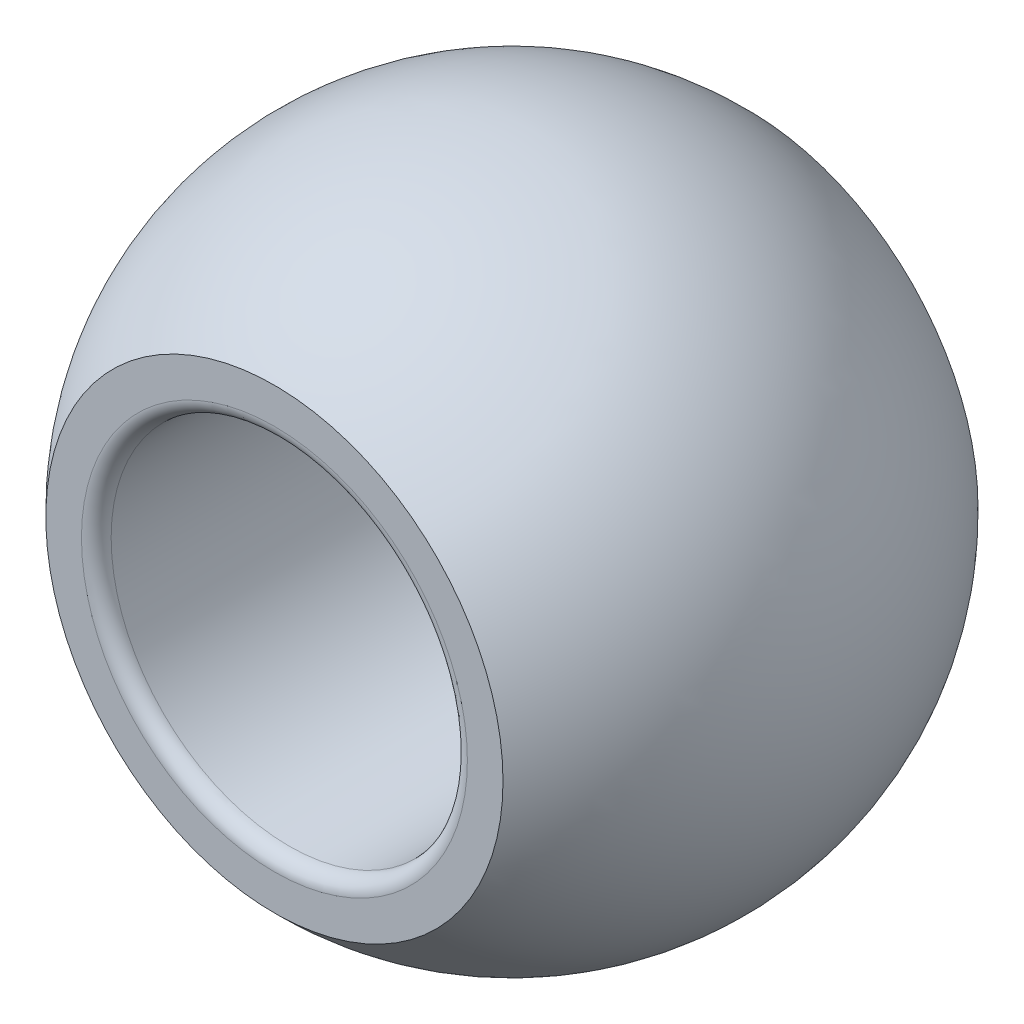
ISO-10303-21;
HEADER;
FILE_DESCRIPTION(('STEP AP214'),'2;1');
FILE_NAME('part.step','',(''),(''),'','','');
FILE_SCHEMA(('AUTOMOTIVE_DESIGN { 1 0 10303 214 1 1 1 1 }'));
ENDSEC;
DATA;
#1=APPLICATION_CONTEXT('core data for automotive mechanical design processes');
#2=APPLICATION_PROTOCOL_DEFINITION('international standard','automotive_design',2000,#1);
#3=PRODUCT_CONTEXT('',#1,'mechanical');
#4=PRODUCT('Part','Part','',(#3));
#5=PRODUCT_RELATED_PRODUCT_CATEGORY('part','',(#4));
#6=PRODUCT_DEFINITION_FORMATION('','',#4);
#7=PRODUCT_DEFINITION_CONTEXT('part definition',#1,'design');
#8=PRODUCT_DEFINITION('design','',#6,#7);
#9=PRODUCT_DEFINITION_SHAPE('','',#8);
#10=(LENGTH_UNIT() NAMED_UNIT(*) SI_UNIT(.MILLI.,.METRE.));
#11=(NAMED_UNIT(*) PLANE_ANGLE_UNIT() SI_UNIT($,.RADIAN.));
#12=(NAMED_UNIT(*) SI_UNIT($,.STERADIAN.) SOLID_ANGLE_UNIT());
#13=UNCERTAINTY_MEASURE_WITH_UNIT(LENGTH_MEASURE(1.E-05),#10,'distance_accuracy_value','');
#14=(GEOMETRIC_REPRESENTATION_CONTEXT(3) GLOBAL_UNCERTAINTY_ASSIGNED_CONTEXT((#13)) GLOBAL_UNIT_ASSIGNED_CONTEXT((#10,
#11,#12)) REPRESENTATION_CONTEXT('',''));
#15=CARTESIAN_POINT('',(0.,0.,0.));
#16=DIRECTION('',(0.,0.,1.));
#17=DIRECTION('',(1.,0.,0.));
#18=AXIS2_PLACEMENT_3D('',#15,#16,#17);
#19=CARTESIAN_POINT('',(0.,0.,-50.));
#20=DIRECTION('',(0.,0.,1.));
#21=DIRECTION('',(1.,0.,0.));
#22=AXIS2_PLACEMENT_3D('',#19,#20,#21);
#23=CYLINDRICAL_SURFACE('',#22,6.);
#24=CARTESIAN_POINT('',(0.,0.,-7.5));
#25=DIRECTION('',(0.,0.,-1.));
#26=DIRECTION('',(-1.,0.,0.));
#27=AXIS2_PLACEMENT_3D('',#24,#25,#26);
#28=CIRCLE('',#27,6.);
#29=CARTESIAN_POINT('',(-6.,0.,-7.5));
#30=VERTEX_POINT('',#29);
#31=EDGE_CURVE('E52',#30,#30,#28,.F.);
#32=ORIENTED_EDGE('',*,*,#31,.F.);
#33=EDGE_LOOP('',(#32));
#34=FACE_BOUND('',#33,.T.);
#35=CARTESIAN_POINT('',(0.,0.,7.5));
#36=DIRECTION('',(0.,0.,-1.));
#37=DIRECTION('',(-1.,0.,0.));
#38=AXIS2_PLACEMENT_3D('',#35,#36,#37);
#39=CIRCLE('',#38,6.);
#40=CARTESIAN_POINT('',(-6.,0.,7.5));
#41=VERTEX_POINT('',#40);
#42=EDGE_CURVE('E100',#41,#41,#39,.T.);
#43=ORIENTED_EDGE('',*,*,#42,.F.);
#44=EDGE_LOOP('',(#43));
#45=FACE_BOUND('',#44,.T.);
#46=ADVANCED_FACE('F17',(#34,#45),#23,.F.);
#47=CARTESIAN_POINT('',(0.,0.,7.5));
#48=DIRECTION('',(0.,0.,-1.));
#49=DIRECTION('',(-1.,0.,0.));
#50=AXIS2_PLACEMENT_3D('',#47,#48,#49);
#51=TOROIDAL_SURFACE('',#50,6.5,0.500000000000001);
#52=CARTESIAN_POINT('',(0.,0.,8.));
#53=DIRECTION('',(0.,0.,1.));
#54=DIRECTION('',(1.,0.,0.));
#55=AXIS2_PLACEMENT_3D('',#52,#53,#54);
#56=CIRCLE('',#55,6.5);
#57=CARTESIAN_POINT('',(-6.5,0.,8.));
#58=VERTEX_POINT('',#57);
#59=CARTESIAN_POINT('',(6.5,0.,8.));
#60=VERTEX_POINT('',#59);
#61=EDGE_CURVE('E47',#58,#60,#56,.F.);
#62=ORIENTED_EDGE('',*,*,#61,.F.);
#63=CARTESIAN_POINT('',(0.,0.,8.));
#64=DIRECTION('',(0.,0.,1.));
#65=DIRECTION('',(-1.,0.,0.));
#66=AXIS2_PLACEMENT_3D('',#63,#64,#65);
#67=CIRCLE('',#66,6.5);
#68=EDGE_CURVE('E44',#60,#58,#67,.F.);
#69=ORIENTED_EDGE('',*,*,#68,.F.);
#70=EDGE_LOOP('',(#62,#69));
#71=FACE_BOUND('',#70,.T.);
#72=ORIENTED_EDGE('',*,*,#42,.T.);
#73=EDGE_LOOP('',(#72));
#74=FACE_BOUND('',#73,.T.);
#75=ADVANCED_FACE('F48',(#71,#74),#51,.T.);
#76=CARTESIAN_POINT('',(0.,0.,-7.5));
#77=DIRECTION('',(0.,0.,-1.));
#78=DIRECTION('',(-1.,0.,0.));
#79=AXIS2_PLACEMENT_3D('',#76,#77,#78);
#80=TOROIDAL_SURFACE('',#79,6.5,0.499999999999999);
#81=CARTESIAN_POINT('',(0.,0.,-8.));
#82=DIRECTION('',(0.,0.,-1.));
#83=DIRECTION('',(1.,0.,0.));
#84=AXIS2_PLACEMENT_3D('',#81,#82,#83);
#85=CIRCLE('',#84,6.5);
#86=CARTESIAN_POINT('',(-6.5,0.,-8.));
#87=VERTEX_POINT('',#86);
#88=CARTESIAN_POINT('',(6.5,0.,-8.));
#89=VERTEX_POINT('',#88);
#90=EDGE_CURVE('E57',#87,#89,#85,.F.);
#91=ORIENTED_EDGE('',*,*,#90,.F.);
#92=CARTESIAN_POINT('',(0.,0.,-8.));
#93=DIRECTION('',(0.,0.,-1.));
#94=DIRECTION('',(-1.,0.,0.));
#95=AXIS2_PLACEMENT_3D('',#92,#93,#94);
#96=CIRCLE('',#95,6.5);
#97=EDGE_CURVE('E35',#89,#87,#96,.F.);
#98=ORIENTED_EDGE('',*,*,#97,.F.);
#99=EDGE_LOOP('',(#91,#98));
#100=FACE_BOUND('',#99,.T.);
#101=ORIENTED_EDGE('',*,*,#31,.T.);
#102=EDGE_LOOP('',(#101));
#103=FACE_BOUND('',#102,.T.);
#104=ADVANCED_FACE('F77',(#100,#103),#80,.T.);
#105=CARTESIAN_POINT('',(0.,7.7,8.));
#106=DIRECTION('',(0.,0.,1.));
#107=DIRECTION('',(1.,0.,0.));
#108=AXIS2_PLACEMENT_3D('',#105,#106,#107);
#109=PLANE('',#108);
#110=ORIENTED_EDGE('',*,*,#61,.T.);
#111=ORIENTED_EDGE('',*,*,#68,.T.);
#112=EDGE_LOOP('',(#110,#111));
#113=FACE_BOUND('',#112,.T.);
#114=CARTESIAN_POINT('',(0.,0.,8.));
#115=DIRECTION('',(0.,0.,1.));
#116=DIRECTION('',(1.,0.,0.));
#117=AXIS2_PLACEMENT_3D('',#114,#115,#116);
#118=CIRCLE('',#117,7.69999999999998);
#119=CARTESIAN_POINT('',(7.69999999999998,0.,8.));
#120=VERTEX_POINT('',#119);
#121=EDGE_CURVE('E27',#120,#120,#118,.F.);
#122=ORIENTED_EDGE('',*,*,#121,.F.);
#123=EDGE_LOOP('',(#122));
#124=FACE_BOUND('',#123,.T.);
#125=ADVANCED_FACE('F55',(#113,#124),#109,.T.);
#126=CARTESIAN_POINT('',(0.,6.49999999999999,-8.));
#127=DIRECTION('',(0.,0.,-1.));
#128=DIRECTION('',(-1.,0.,0.));
#129=AXIS2_PLACEMENT_3D('',#126,#127,#128);
#130=PLANE('',#129);
#131=ORIENTED_EDGE('',*,*,#90,.T.);
#132=ORIENTED_EDGE('',*,*,#97,.T.);
#133=EDGE_LOOP('',(#131,#132));
#134=FACE_BOUND('',#133,.T.);
#135=CARTESIAN_POINT('',(0.,0.,-8.));
#136=DIRECTION('',(0.,0.,1.));
#137=DIRECTION('',(1.,0.,0.));
#138=AXIS2_PLACEMENT_3D('',#135,#136,#137);
#139=CIRCLE('',#138,7.69999999999996);
#140=CARTESIAN_POINT('',(7.69999999999997,0.,-8.));
#141=VERTEX_POINT('',#140);
#142=EDGE_CURVE('E11',#141,#141,#139,.T.);
#143=ORIENTED_EDGE('',*,*,#142,.F.);
#144=EDGE_LOOP('',(#143));
#145=FACE_BOUND('',#144,.T.);
#146=ADVANCED_FACE('F76',(#134,#145),#130,.T.);
#147=CARTESIAN_POINT('',(0.,0.,0.));
#148=DIRECTION('',(0.,0.,1.));
#149=DIRECTION('',(-1.,0.,0.));
#150=AXIS2_PLACEMENT_3D('',#147,#148,#149);
#151=DEGENERATE_TOROIDAL_SURFACE('',#150,0.012824142297065,11.1125,.F.);
#152=ORIENTED_EDGE('',*,*,#121,.T.);
#153=EDGE_LOOP('',(#152));
#154=FACE_BOUND('',#153,.T.);
#155=ORIENTED_EDGE('',*,*,#142,.T.);
#156=EDGE_LOOP('',(#155));
#157=FACE_BOUND('',#156,.T.);
#158=ADVANCED_FACE('F123',(#154,#157),#151,.F.);
#159=CLOSED_SHELL('',(#46,#75,#104,#125,#146,#158));
#160=MANIFOLD_SOLID_BREP('B1',#159);
#161=ADVANCED_BREP_SHAPE_REPRESENTATION('',(#18,#160),#14);
#162=SHAPE_DEFINITION_REPRESENTATION(#9,#161);
ENDSEC;
END-ISO-10303-21;
